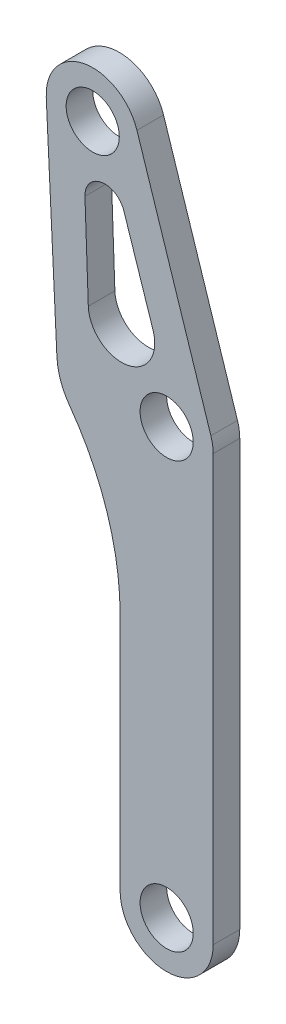
ISO-10303-21;
HEADER;
FILE_DESCRIPTION(('STEP AP214'),'2;1');
FILE_NAME('part.step','',(''),(''),'','','');
FILE_SCHEMA(('AUTOMOTIVE_DESIGN { 1 0 10303 214 1 1 1 1 }'));
ENDSEC;
DATA;
#1=APPLICATION_CONTEXT('core data for automotive mechanical design processes');
#2=APPLICATION_PROTOCOL_DEFINITION('international standard','automotive_design',2000,#1);
#3=PRODUCT_CONTEXT('',#1,'mechanical');
#4=PRODUCT('Part','Part','',(#3));
#5=PRODUCT_RELATED_PRODUCT_CATEGORY('part','',(#4));
#6=PRODUCT_DEFINITION_FORMATION('','',#4);
#7=PRODUCT_DEFINITION_CONTEXT('part definition',#1,'design');
#8=PRODUCT_DEFINITION('design','',#6,#7);
#9=PRODUCT_DEFINITION_SHAPE('','',#8);
#10=(LENGTH_UNIT() NAMED_UNIT(*) SI_UNIT(.MILLI.,.METRE.));
#11=(NAMED_UNIT(*) PLANE_ANGLE_UNIT() SI_UNIT($,.RADIAN.));
#12=(NAMED_UNIT(*) SI_UNIT($,.STERADIAN.) SOLID_ANGLE_UNIT());
#13=UNCERTAINTY_MEASURE_WITH_UNIT(LENGTH_MEASURE(1.E-05),#10,'distance_accuracy_value','');
#14=(GEOMETRIC_REPRESENTATION_CONTEXT(3) GLOBAL_UNCERTAINTY_ASSIGNED_CONTEXT((#13)) GLOBAL_UNIT_ASSIGNED_CONTEXT((#10,
#11,#12)) REPRESENTATION_CONTEXT('',''));
#15=CARTESIAN_POINT('',(0.,0.,0.));
#16=DIRECTION('',(0.,0.,1.));
#17=DIRECTION('',(1.,0.,0.));
#18=AXIS2_PLACEMENT_3D('',#15,#16,#17);
#19=CARTESIAN_POINT('',(0.,0.,2.));
#20=DIRECTION('',(0.,0.,1.));
#21=DIRECTION('',(1.,0.,0.));
#22=AXIS2_PLACEMENT_3D('',#19,#20,#21);
#23=PLANE('',#22);
#24=CARTESIAN_POINT('',(0.,0.,2.));
#25=DIRECTION('',(0.,0.,1.));
#26=DIRECTION('',(1.,0.,0.));
#27=AXIS2_PLACEMENT_3D('',#24,#25,#26);
#28=CIRCLE('',#27,2.);
#29=CARTESIAN_POINT('',(2.,0.,2.));
#30=VERTEX_POINT('',#29);
#31=EDGE_CURVE('E178',#30,#30,#28,.T.);
#32=ORIENTED_EDGE('',*,*,#31,.F.);
#33=EDGE_LOOP('',(#32));
#34=FACE_BOUND('',#33,.T.);
#35=DIRECTION('',(0.0485278948662793,-0.998821827664898,0.));
#36=VECTOR('',#35,1.);
#37=CARTESIAN_POINT('',(-9.05818229557622,48.9491696612808,2.));
#38=LINE('',#37,#36);
#39=CARTESIAN_POINT('',(-9.05818229557622,48.9491696612808,2.));
#40=VERTEX_POINT('',#39);
#41=CARTESIAN_POINT('',(-8.25580243242246,32.4342451296246,2.));
#42=VERTEX_POINT('',#41);
#43=EDGE_CURVE('E202',#40,#42,#38,.T.);
#44=ORIENTED_EDGE('',*,*,#43,.T.);
#45=CARTESIAN_POINT('',(-3.26169329409797,32.676884603956,2.));
#46=DIRECTION('',(0.,0.,1.));
#47=DIRECTION('',(1.,0.,0.));
#48=AXIS2_PLACEMENT_3D('',#45,#46,#47);
#49=CIRCLE('',#48,5.);
#50=CARTESIAN_POINT('',(-7.30935463527838,29.7415076831648,2.));
#51=VERTEX_POINT('',#50);
#52=EDGE_CURVE('E11',#42,#51,#49,.T.);
#53=ORIENTED_EDGE('',*,*,#52,.T.);
#54=CARTESIAN_POINT('',(-23.5,18.,2.));
#55=DIRECTION('',(0.,0.,-1.));
#56=DIRECTION('',(1.,0.,0.));
#57=AXIS2_PLACEMENT_3D('',#54,#55,#56);
#58=CIRCLE('',#57,20.);
#59=CARTESIAN_POINT('',(-3.49999999999999,18.,2.));
#60=VERTEX_POINT('',#59);
#61=EDGE_CURVE('E204',#51,#60,#58,.T.);
#62=ORIENTED_EDGE('',*,*,#61,.T.);
#63=DIRECTION('',(0.,-1.,0.));
#64=VECTOR('',#63,1.);
#65=CARTESIAN_POINT('',(-3.5,0.,2.));
#66=LINE('',#65,#64);
#67=CARTESIAN_POINT('',(-3.5,0.,2.));
#68=VERTEX_POINT('',#67);
#69=EDGE_CURVE('E206',#60,#68,#66,.T.);
#70=ORIENTED_EDGE('',*,*,#69,.T.);
#71=CARTESIAN_POINT('',(0.,0.,2.));
#72=DIRECTION('',(0.,0.,1.));
#73=DIRECTION('',(1.,0.,0.));
#74=AXIS2_PLACEMENT_3D('',#71,#72,#73);
#75=CIRCLE('',#74,3.5);
#76=CARTESIAN_POINT('',(3.5,0.,2.));
#77=VERTEX_POINT('',#76);
#78=EDGE_CURVE('E190',#68,#77,#75,.T.);
#79=ORIENTED_EDGE('',*,*,#78,.T.);
#80=DIRECTION('',(0.,1.,0.));
#81=VECTOR('',#80,1.);
#82=CARTESIAN_POINT('',(3.5,32.,2.));
#83=LINE('',#82,#81);
#84=CARTESIAN_POINT('',(3.5,32.,2.));
#85=VERTEX_POINT('',#84);
#86=EDGE_CURVE('E193',#77,#85,#83,.T.);
#87=ORIENTED_EDGE('',*,*,#86,.T.);
#88=CARTESIAN_POINT('',(0.,32.,2.));
#89=DIRECTION('',(0.,0.,1.));
#90=DIRECTION('',(1.,0.,0.));
#91=AXIS2_PLACEMENT_3D('',#88,#89,#90);
#92=CIRCLE('',#91,3.5);
#93=CARTESIAN_POINT('',(3.32869780703303,33.0815594803123,2.));
#94=VERTEX_POINT('',#93);
#95=EDGE_CURVE('E196',#85,#94,#92,.T.);
#96=ORIENTED_EDGE('',*,*,#95,.T.);
#97=DIRECTION('',(-0.309016994374948,0.951056516295153,0.));
#98=VECTOR('',#97,1.);
#99=CARTESIAN_POINT('',(-2.23360809171604,50.2005767736251,2.));
#100=LINE('',#99,#98);
#101=CARTESIAN_POINT('',(-2.23360809171604,50.2005767736251,2.));
#102=VERTEX_POINT('',#101);
#103=EDGE_CURVE('E198',#94,#102,#100,.T.);
#104=ORIENTED_EDGE('',*,*,#103,.T.);
#105=CARTESIAN_POINT('',(-5.56230589874907,49.1190172933128,2.));
#106=DIRECTION('',(0.,0.,1.));
#107=DIRECTION('',(1.,0.,0.));
#108=AXIS2_PLACEMENT_3D('',#105,#106,#107);
#109=CIRCLE('',#108,3.5);
#110=EDGE_CURVE('E200',#102,#40,#109,.T.);
#111=ORIENTED_EDGE('',*,*,#110,.T.);
#112=EDGE_LOOP('',(#44,#53,#62,#70,#79,#87,#96,#104,#111));
#113=FACE_BOUND('',#112,.T.);
#114=CARTESIAN_POINT('',(0.,32.,2.));
#115=DIRECTION('',(0.,0.,1.));
#116=DIRECTION('',(1.,0.,0.));
#117=AXIS2_PLACEMENT_3D('',#114,#115,#116);
#118=CIRCLE('',#117,2.);
#119=CARTESIAN_POINT('',(2.,32.,2.));
#120=VERTEX_POINT('',#119);
#121=EDGE_CURVE('E184',#120,#120,#118,.T.);
#122=ORIENTED_EDGE('',*,*,#121,.F.);
#123=EDGE_LOOP('',(#122));
#124=FACE_BOUND('',#123,.T.);
#125=CARTESIAN_POINT('',(-5.56230589874907,49.1190172933128,2.));
#126=DIRECTION('',(0.,0.,1.));
#127=DIRECTION('',(1.,0.,0.));
#128=AXIS2_PLACEMENT_3D('',#125,#126,#127);
#129=CIRCLE('',#128,2.);
#130=CARTESIAN_POINT('',(-3.56230589874907,49.1190172933128,2.));
#131=VERTEX_POINT('',#130);
#132=EDGE_CURVE('E172',#131,#131,#129,.T.);
#133=ORIENTED_EDGE('',*,*,#132,.F.);
#134=EDGE_LOOP('',(#133));
#135=FACE_BOUND('',#134,.T.);
#136=DIRECTION('',(0.0357714415518685,-0.999359997182848,0.));
#137=VECTOR('',#136,1.);
#138=CARTESIAN_POINT('',(-6.14635748669496,43.9463428376722,2.));
#139=LINE('',#138,#137);
#140=CARTESIAN_POINT('',(-6.14635748669496,43.9463428376722,2.));
#141=VERTEX_POINT('',#140);
#142=CARTESIAN_POINT('',(-5.89451662093763,36.9105713961203,2.));
#143=VERTEX_POINT('',#142);
#144=EDGE_CURVE('E141',#141,#143,#139,.T.);
#145=ORIENTED_EDGE('',*,*,#144,.F.);
#146=CARTESIAN_POINT('',(-4.64731749092069,44.,2.));
#147=DIRECTION('',(0.,0.,1.));
#148=DIRECTION('',(1.,0.,0.));
#149=AXIS2_PLACEMENT_3D('',#146,#147,#148);
#150=CIRCLE('',#149,1.5);
#151=CARTESIAN_POINT('',(-3.22250997226277,44.4689600566955,2.));
#152=VERTEX_POINT('',#151);
#153=EDGE_CURVE('E131',#152,#141,#150,.T.);
#154=ORIENTED_EDGE('',*,*,#153,.F.);
#155=DIRECTION('',(-0.312640037796997,0.949871679105284,0.));
#156=VECTOR('',#155,1.);
#157=CARTESIAN_POINT('',(-3.22250997226277,44.4689600566955,2.));
#158=LINE('',#157,#156);
#159=CARTESIAN_POINT('',(-1.02143743021729,37.7816000944925,2.));
#160=VERTEX_POINT('',#159);
#161=EDGE_CURVE('E156',#160,#152,#158,.T.);
#162=ORIENTED_EDGE('',*,*,#161,.F.);
#163=CARTESIAN_POINT('',(-3.39611662798051,37.,2.));
#164=DIRECTION('',(0.,0.,1.));
#165=DIRECTION('',(1.,0.,0.));
#166=AXIS2_PLACEMENT_3D('',#163,#164,#165);
#167=CIRCLE('',#166,2.5);
#168=EDGE_CURVE('E154',#143,#160,#167,.T.);
#169=ORIENTED_EDGE('',*,*,#168,.F.);
#170=EDGE_LOOP('',(#145,#154,#162,#169));
#171=FACE_BOUND('',#170,.T.);
#172=ADVANCED_FACE('F35',(#34,#113,#124,#135,#171),#23,.T.);
#173=CARTESIAN_POINT('',(0.,0.,0.));
#174=DIRECTION('',(0.,0.,1.));
#175=DIRECTION('',(1.,0.,0.));
#176=AXIS2_PLACEMENT_3D('',#173,#174,#175);
#177=PLANE('',#176);
#178=CARTESIAN_POINT('',(-5.56230589874907,49.1190172933128,0.));
#179=DIRECTION('',(0.,0.,1.));
#180=DIRECTION('',(1.,0.,0.));
#181=AXIS2_PLACEMENT_3D('',#178,#179,#180);
#182=CIRCLE('',#181,2.);
#183=CARTESIAN_POINT('',(-3.56230589874907,49.1190172933128,0.));
#184=VERTEX_POINT('',#183);
#185=EDGE_CURVE('E149',#184,#184,#182,.T.);
#186=ORIENTED_EDGE('',*,*,#185,.T.);
#187=EDGE_LOOP('',(#186));
#188=FACE_BOUND('',#187,.T.);
#189=CARTESIAN_POINT('',(0.,0.,0.));
#190=DIRECTION('',(0.,0.,1.));
#191=DIRECTION('',(1.,0.,0.));
#192=AXIS2_PLACEMENT_3D('',#189,#190,#191);
#193=CIRCLE('',#192,2.);
#194=CARTESIAN_POINT('',(2.,0.,0.));
#195=VERTEX_POINT('',#194);
#196=EDGE_CURVE('E175',#195,#195,#193,.T.);
#197=ORIENTED_EDGE('',*,*,#196,.T.);
#198=EDGE_LOOP('',(#197));
#199=FACE_BOUND('',#198,.T.);
#200=CARTESIAN_POINT('',(0.,32.,0.));
#201=DIRECTION('',(0.,0.,1.));
#202=DIRECTION('',(1.,0.,0.));
#203=AXIS2_PLACEMENT_3D('',#200,#201,#202);
#204=CIRCLE('',#203,2.);
#205=CARTESIAN_POINT('',(2.,32.,0.));
#206=VERTEX_POINT('',#205);
#207=EDGE_CURVE('E181',#206,#206,#204,.T.);
#208=ORIENTED_EDGE('',*,*,#207,.T.);
#209=EDGE_LOOP('',(#208));
#210=FACE_BOUND('',#209,.T.);
#211=CARTESIAN_POINT('',(-23.5,18.,0.));
#212=DIRECTION('',(0.,0.,-1.));
#213=DIRECTION('',(1.,0.,0.));
#214=AXIS2_PLACEMENT_3D('',#211,#212,#213);
#215=CIRCLE('',#214,20.);
#216=CARTESIAN_POINT('',(-7.30935463527838,29.7415076831648,0.));
#217=VERTEX_POINT('',#216);
#218=CARTESIAN_POINT('',(-3.49999999999999,18.,0.));
#219=VERTEX_POINT('',#218);
#220=EDGE_CURVE('E221',#217,#219,#215,.T.);
#221=ORIENTED_EDGE('',*,*,#220,.F.);
#222=CARTESIAN_POINT('',(-3.26169329409797,32.676884603956,0.));
#223=DIRECTION('',(0.,0.,1.));
#224=DIRECTION('',(1.,0.,0.));
#225=AXIS2_PLACEMENT_3D('',#222,#223,#224);
#226=CIRCLE('',#225,5.);
#227=CARTESIAN_POINT('',(-8.25580243242246,32.4342451296246,0.));
#228=VERTEX_POINT('',#227);
#229=EDGE_CURVE('E57',#217,#228,#226,.F.);
#230=ORIENTED_EDGE('',*,*,#229,.T.);
#231=DIRECTION('',(0.0485278948662793,-0.998821827664898,0.));
#232=VECTOR('',#231,1.);
#233=CARTESIAN_POINT('',(-9.05818229557622,48.9491696612808,0.));
#234=LINE('',#233,#232);
#235=CARTESIAN_POINT('',(-9.05818229557622,48.9491696612808,0.));
#236=VERTEX_POINT('',#235);
#237=EDGE_CURVE('E219',#236,#228,#234,.T.);
#238=ORIENTED_EDGE('',*,*,#237,.F.);
#239=CARTESIAN_POINT('',(-5.56230589874907,49.1190172933128,0.));
#240=DIRECTION('',(0.,0.,1.));
#241=DIRECTION('',(1.,0.,0.));
#242=AXIS2_PLACEMENT_3D('',#239,#240,#241);
#243=CIRCLE('',#242,3.5);
#244=CARTESIAN_POINT('',(-2.23360809171604,50.2005767736251,0.));
#245=VERTEX_POINT('',#244);
#246=EDGE_CURVE('E217',#245,#236,#243,.T.);
#247=ORIENTED_EDGE('',*,*,#246,.F.);
#248=DIRECTION('',(-0.309016994374948,0.951056516295153,0.));
#249=VECTOR('',#248,1.);
#250=CARTESIAN_POINT('',(-2.23360809171604,50.2005767736251,0.));
#251=LINE('',#250,#249);
#252=CARTESIAN_POINT('',(3.32869780703303,33.0815594803123,0.));
#253=VERTEX_POINT('',#252);
#254=EDGE_CURVE('E215',#253,#245,#251,.T.);
#255=ORIENTED_EDGE('',*,*,#254,.F.);
#256=CARTESIAN_POINT('',(0.,32.,0.));
#257=DIRECTION('',(0.,0.,1.));
#258=DIRECTION('',(1.,0.,0.));
#259=AXIS2_PLACEMENT_3D('',#256,#257,#258);
#260=CIRCLE('',#259,3.5);
#261=CARTESIAN_POINT('',(3.5,32.,0.));
#262=VERTEX_POINT('',#261);
#263=EDGE_CURVE('E213',#262,#253,#260,.T.);
#264=ORIENTED_EDGE('',*,*,#263,.F.);
#265=DIRECTION('',(0.,1.,0.));
#266=VECTOR('',#265,1.);
#267=CARTESIAN_POINT('',(3.5,32.,0.));
#268=LINE('',#267,#266);
#269=CARTESIAN_POINT('',(3.5,0.,0.));
#270=VERTEX_POINT('',#269);
#271=EDGE_CURVE('E211',#270,#262,#268,.T.);
#272=ORIENTED_EDGE('',*,*,#271,.F.);
#273=CARTESIAN_POINT('',(0.,0.,0.));
#274=DIRECTION('',(0.,0.,1.));
#275=DIRECTION('',(1.,0.,0.));
#276=AXIS2_PLACEMENT_3D('',#273,#274,#275);
#277=CIRCLE('',#276,3.5);
#278=CARTESIAN_POINT('',(-3.5,0.,0.));
#279=VERTEX_POINT('',#278);
#280=EDGE_CURVE('E187',#279,#270,#277,.T.);
#281=ORIENTED_EDGE('',*,*,#280,.F.);
#282=DIRECTION('',(0.,-1.,0.));
#283=VECTOR('',#282,1.);
#284=CARTESIAN_POINT('',(-3.5,0.,0.));
#285=LINE('',#284,#283);
#286=EDGE_CURVE('E194',#219,#279,#285,.T.);
#287=ORIENTED_EDGE('',*,*,#286,.F.);
#288=EDGE_LOOP('',(#221,#230,#238,#247,#255,#264,#272,#281,#287));
#289=FACE_BOUND('',#288,.T.);
#290=CARTESIAN_POINT('',(-4.64731749092069,44.,0.));
#291=DIRECTION('',(0.,0.,1.));
#292=DIRECTION('',(1.,0.,0.));
#293=AXIS2_PLACEMENT_3D('',#290,#291,#292);
#294=CIRCLE('',#293,1.5);
#295=CARTESIAN_POINT('',(-3.22250997226276,44.4689600566955,0.));
#296=VERTEX_POINT('',#295);
#297=CARTESIAN_POINT('',(-6.14635748669496,43.9463428376722,0.));
#298=VERTEX_POINT('',#297);
#299=EDGE_CURVE('E160',#296,#298,#294,.T.);
#300=ORIENTED_EDGE('',*,*,#299,.T.);
#301=DIRECTION('',(0.0357714415518685,-0.999359997182848,0.));
#302=VECTOR('',#301,1.);
#303=CARTESIAN_POINT('',(-6.14635748669496,43.9463428376722,0.));
#304=LINE('',#303,#302);
#305=CARTESIAN_POINT('',(-5.89451662093763,36.9105713961203,0.));
#306=VERTEX_POINT('',#305);
#307=EDGE_CURVE('E148',#298,#306,#304,.T.);
#308=ORIENTED_EDGE('',*,*,#307,.T.);
#309=CARTESIAN_POINT('',(-3.39611662798051,37.,0.));
#310=DIRECTION('',(0.,0.,1.));
#311=DIRECTION('',(1.,0.,0.));
#312=AXIS2_PLACEMENT_3D('',#309,#310,#311);
#313=CIRCLE('',#312,2.5);
#314=CARTESIAN_POINT('',(-1.02143743021729,37.7816000944925,0.));
#315=VERTEX_POINT('',#314);
#316=EDGE_CURVE('E163',#306,#315,#313,.T.);
#317=ORIENTED_EDGE('',*,*,#316,.T.);
#318=DIRECTION('',(-0.312640037796997,0.949871679105284,0.));
#319=VECTOR('',#318,1.);
#320=CARTESIAN_POINT('',(-3.22250997226277,44.4689600566955,0.));
#321=LINE('',#320,#319);
#322=EDGE_CURVE('E142',#315,#296,#321,.T.);
#323=ORIENTED_EDGE('',*,*,#322,.T.);
#324=EDGE_LOOP('',(#300,#308,#317,#323));
#325=FACE_BOUND('',#324,.T.);
#326=ADVANCED_FACE('F255',(#188,#199,#210,#289,#325),#177,.F.);
#327=CARTESIAN_POINT('',(0.,0.,2.));
#328=DIRECTION('',(0.,0.,-1.));
#329=DIRECTION('',(-1.,0.,0.));
#330=AXIS2_PLACEMENT_3D('',#327,#328,#329);
#331=CYLINDRICAL_SURFACE('',#330,3.5);
#332=ORIENTED_EDGE('',*,*,#280,.T.);
#333=DIRECTION('',(0.,0.,-1.));
#334=VECTOR('',#333,1.);
#335=CARTESIAN_POINT('',(3.5,0.,2.));
#336=LINE('',#335,#334);
#337=EDGE_CURVE('E241',#77,#270,#336,.T.);
#338=ORIENTED_EDGE('',*,*,#337,.F.);
#339=ORIENTED_EDGE('',*,*,#78,.F.);
#340=DIRECTION('',(0.,0.,-1.));
#341=VECTOR('',#340,1.);
#342=CARTESIAN_POINT('',(-3.5,0.,2.));
#343=LINE('',#342,#341);
#344=EDGE_CURVE('E208',#68,#279,#343,.T.);
#345=ORIENTED_EDGE('',*,*,#344,.T.);
#346=EDGE_LOOP('',(#332,#338,#339,#345));
#347=FACE_BOUND('',#346,.T.);
#348=ADVANCED_FACE('F264',(#347),#331,.T.);
#349=CARTESIAN_POINT('',(3.5,32.,2.));
#350=DIRECTION('',(-1.,0.,0.));
#351=DIRECTION('',(0.,-1.,0.));
#352=AXIS2_PLACEMENT_3D('',#349,#350,#351);
#353=PLANE('',#352);
#354=ORIENTED_EDGE('',*,*,#271,.T.);
#355=DIRECTION('',(0.,0.,-1.));
#356=VECTOR('',#355,1.);
#357=CARTESIAN_POINT('',(3.5,32.,2.));
#358=LINE('',#357,#356);
#359=EDGE_CURVE('E238',#85,#262,#358,.T.);
#360=ORIENTED_EDGE('',*,*,#359,.F.);
#361=ORIENTED_EDGE('',*,*,#86,.F.);
#362=ORIENTED_EDGE('',*,*,#337,.T.);
#363=EDGE_LOOP('',(#354,#360,#361,#362));
#364=FACE_BOUND('',#363,.T.);
#365=ADVANCED_FACE('F308',(#364),#353,.F.);
#366=CARTESIAN_POINT('',(0.,32.,2.));
#367=DIRECTION('',(0.,0.,-1.));
#368=DIRECTION('',(-1.,0.,0.));
#369=AXIS2_PLACEMENT_3D('',#366,#367,#368);
#370=CYLINDRICAL_SURFACE('',#369,3.5);
#371=ORIENTED_EDGE('',*,*,#263,.T.);
#372=DIRECTION('',(0.,0.,-1.));
#373=VECTOR('',#372,1.);
#374=CARTESIAN_POINT('',(3.32869780703303,33.0815594803123,2.));
#375=LINE('',#374,#373);
#376=EDGE_CURVE('E235',#94,#253,#375,.T.);
#377=ORIENTED_EDGE('',*,*,#376,.F.);
#378=ORIENTED_EDGE('',*,*,#95,.F.);
#379=ORIENTED_EDGE('',*,*,#359,.T.);
#380=EDGE_LOOP('',(#371,#377,#378,#379));
#381=FACE_BOUND('',#380,.T.);
#382=ADVANCED_FACE('F304',(#381),#370,.T.);
#383=CARTESIAN_POINT('',(-2.23360809171604,50.2005767736251,2.));
#384=DIRECTION('',(-0.951056516295153,-0.309016994374948,0.));
#385=DIRECTION('',(0.309016994374948,-0.951056516295153,0.));
#386=AXIS2_PLACEMENT_3D('',#383,#384,#385);
#387=PLANE('',#386);
#388=ORIENTED_EDGE('',*,*,#254,.T.);
#389=DIRECTION('',(0.,0.,-1.));
#390=VECTOR('',#389,1.);
#391=CARTESIAN_POINT('',(-2.23360809171604,50.2005767736251,2.));
#392=LINE('',#391,#390);
#393=EDGE_CURVE('E232',#102,#245,#392,.T.);
#394=ORIENTED_EDGE('',*,*,#393,.F.);
#395=ORIENTED_EDGE('',*,*,#103,.F.);
#396=ORIENTED_EDGE('',*,*,#376,.T.);
#397=EDGE_LOOP('',(#388,#394,#395,#396));
#398=FACE_BOUND('',#397,.T.);
#399=ADVANCED_FACE('F300',(#398),#387,.F.);
#400=CARTESIAN_POINT('',(-5.56230589874907,49.1190172933128,2.));
#401=DIRECTION('',(0.,0.,-1.));
#402=DIRECTION('',(-1.,0.,0.));
#403=AXIS2_PLACEMENT_3D('',#400,#401,#402);
#404=CYLINDRICAL_SURFACE('',#403,3.5);
#405=ORIENTED_EDGE('',*,*,#246,.T.);
#406=DIRECTION('',(0.,0.,-1.));
#407=VECTOR('',#406,1.);
#408=CARTESIAN_POINT('',(-9.05818229557622,48.9491696612808,2.));
#409=LINE('',#408,#407);
#410=EDGE_CURVE('E229',#40,#236,#409,.T.);
#411=ORIENTED_EDGE('',*,*,#410,.F.);
#412=ORIENTED_EDGE('',*,*,#110,.F.);
#413=ORIENTED_EDGE('',*,*,#393,.T.);
#414=EDGE_LOOP('',(#405,#411,#412,#413));
#415=FACE_BOUND('',#414,.T.);
#416=ADVANCED_FACE('F297',(#415),#404,.T.);
#417=CARTESIAN_POINT('',(-9.05818229557622,48.9491696612808,2.));
#418=DIRECTION('',(0.998821827664898,0.0485278948662793,0.));
#419=DIRECTION('',(-0.0485278948662793,0.998821827664898,0.));
#420=AXIS2_PLACEMENT_3D('',#417,#418,#419);
#421=PLANE('',#420);
#422=ORIENTED_EDGE('',*,*,#237,.T.);
#423=DIRECTION('',(0.,0.,-1.));
#424=VECTOR('',#423,1.);
#425=CARTESIAN_POINT('',(-8.25580243242246,32.4342451296246,2.));
#426=LINE('',#425,#424);
#427=EDGE_CURVE('E43',#228,#42,#426,.F.);
#428=ORIENTED_EDGE('',*,*,#427,.T.);
#429=ORIENTED_EDGE('',*,*,#43,.F.);
#430=ORIENTED_EDGE('',*,*,#410,.T.);
#431=EDGE_LOOP('',(#422,#428,#429,#430));
#432=FACE_BOUND('',#431,.T.);
#433=ADVANCED_FACE('F294',(#432),#421,.F.);
#434=CARTESIAN_POINT('',(-23.5,18.,2.));
#435=DIRECTION('',(0.,0.,-1.));
#436=DIRECTION('',(-1.,0.,0.));
#437=AXIS2_PLACEMENT_3D('',#434,#435,#436);
#438=CYLINDRICAL_SURFACE('',#437,20.);
#439=ORIENTED_EDGE('',*,*,#61,.F.);
#440=DIRECTION('',(0.,0.,-1.));
#441=VECTOR('',#440,1.);
#442=CARTESIAN_POINT('',(-7.30935463527838,29.7415076831648,2.));
#443=LINE('',#442,#441);
#444=EDGE_CURVE('E244',#51,#217,#443,.T.);
#445=ORIENTED_EDGE('',*,*,#444,.T.);
#446=ORIENTED_EDGE('',*,*,#220,.T.);
#447=DIRECTION('',(0.,0.,-1.));
#448=VECTOR('',#447,1.);
#449=CARTESIAN_POINT('',(-3.49999999999999,18.,2.));
#450=LINE('',#449,#448);
#451=EDGE_CURVE('E226',#60,#219,#450,.T.);
#452=ORIENTED_EDGE('',*,*,#451,.F.);
#453=EDGE_LOOP('',(#439,#445,#446,#452));
#454=FACE_BOUND('',#453,.T.);
#455=ADVANCED_FACE('F250',(#454),#438,.F.);
#456=CARTESIAN_POINT('',(-3.5,0.,2.));
#457=DIRECTION('',(1.,0.,0.));
#458=DIRECTION('',(0.,1.,0.));
#459=AXIS2_PLACEMENT_3D('',#456,#457,#458);
#460=PLANE('',#459);
#461=ORIENTED_EDGE('',*,*,#286,.T.);
#462=ORIENTED_EDGE('',*,*,#344,.F.);
#463=ORIENTED_EDGE('',*,*,#69,.F.);
#464=ORIENTED_EDGE('',*,*,#451,.T.);
#465=EDGE_LOOP('',(#461,#462,#463,#464));
#466=FACE_BOUND('',#465,.T.);
#467=ADVANCED_FACE('F260',(#466),#460,.F.);
#468=CARTESIAN_POINT('',(0.,32.,2.));
#469=DIRECTION('',(0.,0.,-1.));
#470=DIRECTION('',(-1.,0.,0.));
#471=AXIS2_PLACEMENT_3D('',#468,#469,#470);
#472=CYLINDRICAL_SURFACE('',#471,2.);
#473=ORIENTED_EDGE('',*,*,#121,.T.);
#474=EDGE_LOOP('',(#473));
#475=FACE_BOUND('',#474,.T.);
#476=ORIENTED_EDGE('',*,*,#207,.F.);
#477=EDGE_LOOP('',(#476));
#478=FACE_BOUND('',#477,.T.);
#479=ADVANCED_FACE('F287',(#475,#478),#472,.F.);
#480=CARTESIAN_POINT('',(0.,0.,2.));
#481=DIRECTION('',(0.,0.,-1.));
#482=DIRECTION('',(-1.,0.,0.));
#483=AXIS2_PLACEMENT_3D('',#480,#481,#482);
#484=CYLINDRICAL_SURFACE('',#483,2.);
#485=ORIENTED_EDGE('',*,*,#31,.T.);
#486=EDGE_LOOP('',(#485));
#487=FACE_BOUND('',#486,.T.);
#488=ORIENTED_EDGE('',*,*,#196,.F.);
#489=EDGE_LOOP('',(#488));
#490=FACE_BOUND('',#489,.T.);
#491=ADVANCED_FACE('F351',(#487,#490),#484,.F.);
#492=CARTESIAN_POINT('',(-5.56230589874907,49.1190172933128,2.));
#493=DIRECTION('',(0.,0.,-1.));
#494=DIRECTION('',(-1.,0.,0.));
#495=AXIS2_PLACEMENT_3D('',#492,#493,#494);
#496=CYLINDRICAL_SURFACE('',#495,2.);
#497=ORIENTED_EDGE('',*,*,#132,.T.);
#498=EDGE_LOOP('',(#497));
#499=FACE_BOUND('',#498,.T.);
#500=ORIENTED_EDGE('',*,*,#185,.F.);
#501=EDGE_LOOP('',(#500));
#502=FACE_BOUND('',#501,.T.);
#503=ADVANCED_FACE('F358',(#499,#502),#496,.F.);
#504=CARTESIAN_POINT('',(-4.64731749092069,44.,2.));
#505=DIRECTION('',(0.,0.,-1.));
#506=DIRECTION('',(-1.,0.,0.));
#507=AXIS2_PLACEMENT_3D('',#504,#505,#506);
#508=CYLINDRICAL_SURFACE('',#507,1.5);
#509=ORIENTED_EDGE('',*,*,#299,.F.);
#510=DIRECTION('',(0.,0.,-1.));
#511=VECTOR('',#510,1.);
#512=CARTESIAN_POINT('',(-3.22250997226277,44.4689600566955,2.));
#513=LINE('',#512,#511);
#514=EDGE_CURVE('E137',#152,#296,#513,.T.);
#515=ORIENTED_EDGE('',*,*,#514,.F.);
#516=ORIENTED_EDGE('',*,*,#153,.T.);
#517=DIRECTION('',(0.,0.,-1.));
#518=VECTOR('',#517,1.);
#519=CARTESIAN_POINT('',(-6.14635748669496,43.9463428376722,2.));
#520=LINE('',#519,#518);
#521=EDGE_CURVE('E134',#141,#298,#520,.T.);
#522=ORIENTED_EDGE('',*,*,#521,.T.);
#523=EDGE_LOOP('',(#509,#515,#516,#522));
#524=FACE_BOUND('',#523,.T.);
#525=ADVANCED_FACE('F133',(#524),#508,.F.);
#526=CARTESIAN_POINT('',(-6.14635748669496,43.9463428376722,2.));
#527=DIRECTION('',(0.999359997182848,0.0357714415518685,0.));
#528=DIRECTION('',(-0.0357714415518685,0.999359997182848,0.));
#529=AXIS2_PLACEMENT_3D('',#526,#527,#528);
#530=PLANE('',#529);
#531=ORIENTED_EDGE('',*,*,#307,.F.);
#532=ORIENTED_EDGE('',*,*,#521,.F.);
#533=ORIENTED_EDGE('',*,*,#144,.T.);
#534=DIRECTION('',(0.,0.,-1.));
#535=VECTOR('',#534,1.);
#536=CARTESIAN_POINT('',(-5.89451662093763,36.9105713961203,2.));
#537=LINE('',#536,#535);
#538=EDGE_CURVE('E150',#143,#306,#537,.T.);
#539=ORIENTED_EDGE('',*,*,#538,.T.);
#540=EDGE_LOOP('',(#531,#532,#533,#539));
#541=FACE_BOUND('',#540,.T.);
#542=ADVANCED_FACE('F145',(#541),#530,.T.);
#543=CARTESIAN_POINT('',(-3.39611662798051,37.,2.));
#544=DIRECTION('',(0.,0.,-1.));
#545=DIRECTION('',(-1.,0.,0.));
#546=AXIS2_PLACEMENT_3D('',#543,#544,#545);
#547=CYLINDRICAL_SURFACE('',#546,2.5);
#548=ORIENTED_EDGE('',*,*,#316,.F.);
#549=ORIENTED_EDGE('',*,*,#538,.F.);
#550=ORIENTED_EDGE('',*,*,#168,.T.);
#551=DIRECTION('',(0.,0.,-1.));
#552=VECTOR('',#551,1.);
#553=CARTESIAN_POINT('',(-1.02143743021729,37.7816000944925,2.));
#554=LINE('',#553,#552);
#555=EDGE_CURVE('E169',#160,#315,#554,.T.);
#556=ORIENTED_EDGE('',*,*,#555,.T.);
#557=EDGE_LOOP('',(#548,#549,#550,#556));
#558=FACE_BOUND('',#557,.T.);
#559=ADVANCED_FACE('F274',(#558),#547,.F.);
#560=CARTESIAN_POINT('',(-3.22250997226277,44.4689600566955,2.));
#561=DIRECTION('',(-0.949871679105284,-0.312640037796997,0.));
#562=DIRECTION('',(0.312640037796997,-0.949871679105284,0.));
#563=AXIS2_PLACEMENT_3D('',#560,#561,#562);
#564=PLANE('',#563);
#565=ORIENTED_EDGE('',*,*,#322,.F.);
#566=ORIENTED_EDGE('',*,*,#555,.F.);
#567=ORIENTED_EDGE('',*,*,#161,.T.);
#568=ORIENTED_EDGE('',*,*,#514,.T.);
#569=EDGE_LOOP('',(#565,#566,#567,#568));
#570=FACE_BOUND('',#569,.T.);
#571=ADVANCED_FACE('F270',(#570),#564,.T.);
#572=CARTESIAN_POINT('',(-3.26169329409797,32.676884603956,2.));
#573=DIRECTION('',(0.,0.,-1.));
#574=DIRECTION('',(-1.,0.,0.));
#575=AXIS2_PLACEMENT_3D('',#572,#573,#574);
#576=CYLINDRICAL_SURFACE('',#575,5.);
#577=ORIENTED_EDGE('',*,*,#52,.F.);
#578=ORIENTED_EDGE('',*,*,#427,.F.);
#579=ORIENTED_EDGE('',*,*,#229,.F.);
#580=ORIENTED_EDGE('',*,*,#444,.F.);
#581=EDGE_LOOP('',(#577,#578,#579,#580));
#582=FACE_BOUND('',#581,.T.);
#583=ADVANCED_FACE('F37',(#582),#576,.T.);
#584=CLOSED_SHELL('',(#172,#326,#348,#365,#382,#399,#416,#433,#455,#467,#479,#491,#503,#525,
#542,#559,#571,#583));
#585=MANIFOLD_SOLID_BREP('B2',#584);
#586=ADVANCED_BREP_SHAPE_REPRESENTATION('',(#18,#585),#14);
#587=SHAPE_DEFINITION_REPRESENTATION(#9,#586);
ENDSEC;
END-ISO-10303-21;
